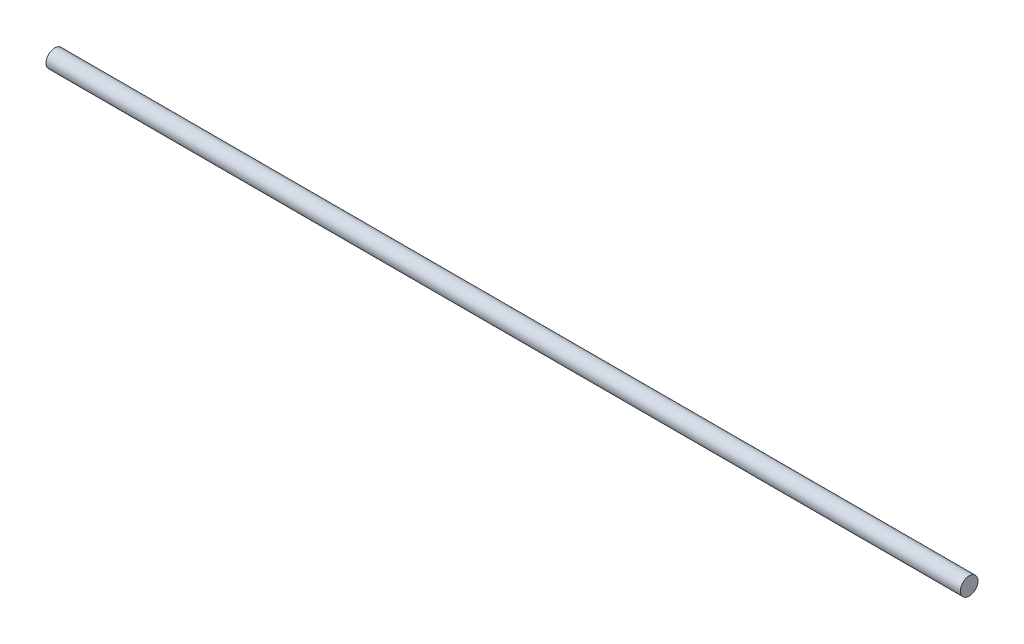
ISO-10303-21;
HEADER;
FILE_DESCRIPTION(('STEP AP214'),'2;1');
FILE_NAME('part.step','',(''),(''),'','','');
FILE_SCHEMA(('AUTOMOTIVE_DESIGN { 1 0 10303 214 1 1 1 1 }'));
ENDSEC;
DATA;
#1=APPLICATION_CONTEXT('core data for automotive mechanical design processes');
#2=APPLICATION_PROTOCOL_DEFINITION('international standard','automotive_design',2000,#1);
#3=PRODUCT_CONTEXT('',#1,'mechanical');
#4=PRODUCT('Part','Part','',(#3));
#5=PRODUCT_RELATED_PRODUCT_CATEGORY('part','',(#4));
#6=PRODUCT_DEFINITION_FORMATION('','',#4);
#7=PRODUCT_DEFINITION_CONTEXT('part definition',#1,'design');
#8=PRODUCT_DEFINITION('design','',#6,#7);
#9=PRODUCT_DEFINITION_SHAPE('','',#8);
#10=(LENGTH_UNIT() NAMED_UNIT(*) SI_UNIT(.MILLI.,.METRE.));
#11=(NAMED_UNIT(*) PLANE_ANGLE_UNIT() SI_UNIT($,.RADIAN.));
#12=(NAMED_UNIT(*) SI_UNIT($,.STERADIAN.) SOLID_ANGLE_UNIT());
#13=UNCERTAINTY_MEASURE_WITH_UNIT(LENGTH_MEASURE(1.E-05),#10,'distance_accuracy_value','');
#14=(GEOMETRIC_REPRESENTATION_CONTEXT(3) GLOBAL_UNCERTAINTY_ASSIGNED_CONTEXT((#13)) GLOBAL_UNIT_ASSIGNED_CONTEXT((#10,
#11,#12)) REPRESENTATION_CONTEXT('',''));
#15=CARTESIAN_POINT('',(0.,0.,0.));
#16=DIRECTION('',(0.,0.,1.));
#17=DIRECTION('',(1.,0.,0.));
#18=AXIS2_PLACEMENT_3D('',#15,#16,#17);
#19=CARTESIAN_POINT('',(330.2,0.,0.));
#20=DIRECTION('',(-1.,0.,0.));
#21=DIRECTION('',(0.,0.,1.));
#22=AXIS2_PLACEMENT_3D('',#19,#20,#21);
#23=CYLINDRICAL_SURFACE('',#22,3.175);
#24=CARTESIAN_POINT('',(330.2,0.,0.));
#25=DIRECTION('',(1.,0.,0.));
#26=DIRECTION('',(0.,0.,-1.));
#27=AXIS2_PLACEMENT_3D('',#24,#25,#26);
#28=CIRCLE('',#27,3.175);
#29=CARTESIAN_POINT('',(330.2,0.,-3.175));
#30=VERTEX_POINT('',#29);
#31=EDGE_CURVE('E10',#30,#30,#28,.T.);
#32=ORIENTED_EDGE('',*,*,#31,.F.);
#33=EDGE_LOOP('',(#32));
#34=FACE_BOUND('',#33,.T.);
#35=CARTESIAN_POINT('',(0.,0.,0.));
#36=DIRECTION('',(1.,0.,0.));
#37=DIRECTION('',(0.,0.,-1.));
#38=AXIS2_PLACEMENT_3D('',#35,#36,#37);
#39=CIRCLE('',#38,3.175);
#40=CARTESIAN_POINT('',(0.,0.,-3.175));
#41=VERTEX_POINT('',#40);
#42=EDGE_CURVE('E38',#41,#41,#39,.T.);
#43=ORIENTED_EDGE('',*,*,#42,.T.);
#44=EDGE_LOOP('',(#43));
#45=FACE_BOUND('',#44,.T.);
#46=ADVANCED_FACE('F35',(#34,#45),#23,.T.);
#47=CARTESIAN_POINT('',(330.2,0.,0.));
#48=DIRECTION('',(1.,0.,0.));
#49=DIRECTION('',(0.,0.,-1.));
#50=AXIS2_PLACEMENT_3D('',#47,#48,#49);
#51=PLANE('',#50);
#52=ORIENTED_EDGE('',*,*,#31,.T.);
#53=EDGE_LOOP('',(#52));
#54=FACE_BOUND('',#53,.T.);
#55=ADVANCED_FACE('F50',(#54),#51,.T.);
#56=CARTESIAN_POINT('',(0.,0.,0.));
#57=DIRECTION('',(1.,0.,0.));
#58=DIRECTION('',(0.,0.,-1.));
#59=AXIS2_PLACEMENT_3D('',#56,#57,#58);
#60=PLANE('',#59);
#61=ORIENTED_EDGE('',*,*,#42,.F.);
#62=EDGE_LOOP('',(#61));
#63=FACE_BOUND('',#62,.T.);
#64=ADVANCED_FACE('F48',(#63),#60,.F.);
#65=CLOSED_SHELL('',(#46,#55,#64));
#66=MANIFOLD_SOLID_BREP('B2',#65);
#67=ADVANCED_BREP_SHAPE_REPRESENTATION('',(#18,#66),#14);
#68=SHAPE_DEFINITION_REPRESENTATION(#9,#67);
ENDSEC;
END-ISO-10303-21;
